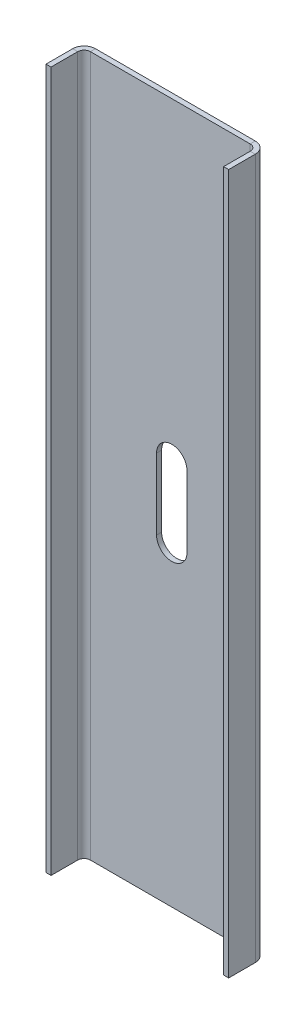
ISO-10303-21;
HEADER;
FILE_DESCRIPTION(('STEP AP214'),'2;1');
FILE_NAME('part.step','',(''),(''),'','','');
FILE_SCHEMA(('AUTOMOTIVE_DESIGN { 1 0 10303 214 1 1 1 1 }'));
ENDSEC;
DATA;
#1=APPLICATION_CONTEXT('core data for automotive mechanical design processes');
#2=APPLICATION_PROTOCOL_DEFINITION('international standard','automotive_design',2000,#1);
#3=PRODUCT_CONTEXT('',#1,'mechanical');
#4=PRODUCT('Part','Part','',(#3));
#5=PRODUCT_RELATED_PRODUCT_CATEGORY('part','',(#4));
#6=PRODUCT_DEFINITION_FORMATION('','',#4);
#7=PRODUCT_DEFINITION_CONTEXT('part definition',#1,'design');
#8=PRODUCT_DEFINITION('design','',#6,#7);
#9=PRODUCT_DEFINITION_SHAPE('','',#8);
#10=(LENGTH_UNIT() NAMED_UNIT(*) SI_UNIT(.MILLI.,.METRE.));
#11=(NAMED_UNIT(*) PLANE_ANGLE_UNIT() SI_UNIT($,.RADIAN.));
#12=(NAMED_UNIT(*) SI_UNIT($,.STERADIAN.) SOLID_ANGLE_UNIT());
#13=UNCERTAINTY_MEASURE_WITH_UNIT(LENGTH_MEASURE(1.E-05),#10,'distance_accuracy_value','');
#14=(GEOMETRIC_REPRESENTATION_CONTEXT(3) GLOBAL_UNCERTAINTY_ASSIGNED_CONTEXT((#13)) GLOBAL_UNIT_ASSIGNED_CONTEXT((#10,
#11,#12)) REPRESENTATION_CONTEXT('',''));
#15=CARTESIAN_POINT('',(0.,0.,0.));
#16=DIRECTION('',(0.,0.,1.));
#17=DIRECTION('',(1.,0.,0.));
#18=AXIS2_PLACEMENT_3D('',#15,#16,#17);
#19=CARTESIAN_POINT('',(0.,0.,-2.));
#20=DIRECTION('',(0.,0.,-1.));
#21=DIRECTION('',(-1.,0.,0.));
#22=AXIS2_PLACEMENT_3D('',#19,#20,#21);
#23=PLANE('',#22);
#24=DIRECTION('',(1.,0.,0.));
#25=VECTOR('',#24,1.);
#26=CARTESIAN_POINT('',(55.8,-102.375,-2.));
#27=LINE('',#26,#25);
#28=CARTESIAN_POINT('',(-11.7,-102.375,-2.00000000000003));
#29=VERTEX_POINT('',#28);
#30=CARTESIAN_POINT('',(51.3,-102.375,-2.));
#31=VERTEX_POINT('',#30);
#32=EDGE_CURVE('E327',#29,#31,#27,.T.);
#33=ORIENTED_EDGE('',*,*,#32,.F.);
#34=DIRECTION('',(0.,-1.,0.));
#35=VECTOR('',#34,1.);
#36=CARTESIAN_POINT('',(-11.7,-102.375,-2.00000000000003));
#37=LINE('',#36,#35);
#38=CARTESIAN_POINT('',(-11.7,173.625,-2.));
#39=VERTEX_POINT('',#38);
#40=EDGE_CURVE('E247',#29,#39,#37,.F.);
#41=ORIENTED_EDGE('',*,*,#40,.T.);
#42=DIRECTION('',(-1.,0.,0.));
#43=VECTOR('',#42,1.);
#44=CARTESIAN_POINT('',(55.8,173.625,-2.));
#45=LINE('',#44,#43);
#46=CARTESIAN_POINT('',(51.2999999999999,173.625,-2.00000000000001));
#47=VERTEX_POINT('',#46);
#48=EDGE_CURVE('E324',#47,#39,#45,.T.);
#49=ORIENTED_EDGE('',*,*,#48,.F.);
#50=DIRECTION('',(0.,1.,0.));
#51=VECTOR('',#50,1.);
#52=CARTESIAN_POINT('',(51.2999999999999,173.625,-2.00000000000001));
#53=LINE('',#52,#51);
#54=EDGE_CURVE('E300',#47,#31,#53,.F.);
#55=ORIENTED_EDGE('',*,*,#54,.T.);
#56=EDGE_LOOP('',(#33,#41,#49,#55));
#57=FACE_BOUND('',#56,.T.);
#58=DIRECTION('',(0.,1.,0.));
#59=VECTOR('',#58,1.);
#60=CARTESIAN_POINT('',(26.3825805897294,49.6250000000001,-2.00000000000003));
#61=LINE('',#60,#59);
#62=CARTESIAN_POINT('',(26.3825805897295,21.6250000000001,-2.00000000000003));
#63=VERTEX_POINT('',#62);
#64=CARTESIAN_POINT('',(26.3825805897294,49.6250000000001,-2.));
#65=VERTEX_POINT('',#64);
#66=EDGE_CURVE('E208',#63,#65,#61,.T.);
#67=ORIENTED_EDGE('',*,*,#66,.T.);
#68=CARTESIAN_POINT('',(20.3825805897294,49.6250000000001,-2.00000000000003));
#69=DIRECTION('',(0.,0.,1.));
#70=DIRECTION('',(1.,0.,0.));
#71=AXIS2_PLACEMENT_3D('',#68,#69,#70);
#72=CIRCLE('',#71,5.99999999999999);
#73=CARTESIAN_POINT('',(14.3825805897294,49.625,-2.00000000000003));
#74=VERTEX_POINT('',#73);
#75=EDGE_CURVE('E93',#65,#74,#72,.T.);
#76=ORIENTED_EDGE('',*,*,#75,.T.);
#77=DIRECTION('',(0.,-1.,0.));
#78=VECTOR('',#77,1.);
#79=CARTESIAN_POINT('',(14.3825805897294,49.625,-2.00000000000003));
#80=LINE('',#79,#78);
#81=CARTESIAN_POINT('',(14.3825805897295,21.6250000000001,-2.00000000000003));
#82=VERTEX_POINT('',#81);
#83=EDGE_CURVE('E199',#74,#82,#80,.T.);
#84=ORIENTED_EDGE('',*,*,#83,.T.);
#85=CARTESIAN_POINT('',(20.3825805897295,21.6250000000001,-2.00000000000003));
#86=DIRECTION('',(0.,0.,1.));
#87=DIRECTION('',(1.,0.,0.));
#88=AXIS2_PLACEMENT_3D('',#85,#86,#87);
#89=CIRCLE('',#88,6.);
#90=EDGE_CURVE('E205',#82,#63,#89,.T.);
#91=ORIENTED_EDGE('',*,*,#90,.T.);
#92=EDGE_LOOP('',(#67,#76,#84,#91));
#93=FACE_BOUND('',#92,.T.);
#94=ADVANCED_FACE('F78',(#57,#93),#23,.T.);
#95=CARTESIAN_POINT('',(0.,0.,0.));
#96=DIRECTION('',(0.,0.,-1.));
#97=DIRECTION('',(-1.,0.,0.));
#98=AXIS2_PLACEMENT_3D('',#95,#96,#97);
#99=PLANE('',#98);
#100=DIRECTION('',(0.,-1.,0.));
#101=VECTOR('',#100,1.);
#102=CARTESIAN_POINT('',(-11.7,-102.375,0.));
#103=LINE('',#102,#101);
#104=CARTESIAN_POINT('',(-11.7,-102.375,0.));
#105=VERTEX_POINT('',#104);
#106=CARTESIAN_POINT('',(-11.7,173.625,0.));
#107=VERTEX_POINT('',#106);
#108=EDGE_CURVE('E260',#105,#107,#103,.F.);
#109=ORIENTED_EDGE('',*,*,#108,.F.);
#110=DIRECTION('',(1.,0.,0.));
#111=VECTOR('',#110,1.);
#112=CARTESIAN_POINT('',(55.8,-102.375,0.));
#113=LINE('',#112,#111);
#114=CARTESIAN_POINT('',(51.3,-102.375,0.));
#115=VERTEX_POINT('',#114);
#116=EDGE_CURVE('E328',#105,#115,#113,.T.);
#117=ORIENTED_EDGE('',*,*,#116,.T.);
#118=DIRECTION('',(0.,1.,0.));
#119=VECTOR('',#118,1.);
#120=CARTESIAN_POINT('',(51.3,173.625,0.));
#121=LINE('',#120,#119);
#122=CARTESIAN_POINT('',(51.3,173.625,0.));
#123=VERTEX_POINT('',#122);
#124=EDGE_CURVE('E313',#123,#115,#121,.F.);
#125=ORIENTED_EDGE('',*,*,#124,.F.);
#126=DIRECTION('',(-1.,0.,0.));
#127=VECTOR('',#126,1.);
#128=CARTESIAN_POINT('',(55.8,173.625,0.));
#129=LINE('',#128,#127);
#130=EDGE_CURVE('E321',#123,#107,#129,.T.);
#131=ORIENTED_EDGE('',*,*,#130,.T.);
#132=EDGE_LOOP('',(#109,#117,#125,#131));
#133=FACE_BOUND('',#132,.T.);
#134=CARTESIAN_POINT('',(20.3825805897294,49.6250000000001,0.));
#135=DIRECTION('',(0.,0.,-1.));
#136=DIRECTION('',(-1.,0.,0.));
#137=AXIS2_PLACEMENT_3D('',#134,#135,#136);
#138=CIRCLE('',#137,5.99999999999999);
#139=CARTESIAN_POINT('',(26.3825805897294,49.6250000000001,0.));
#140=VERTEX_POINT('',#139);
#141=CARTESIAN_POINT('',(14.3825805897294,49.625,0.));
#142=VERTEX_POINT('',#141);
#143=EDGE_CURVE('E13',#140,#142,#138,.F.);
#144=ORIENTED_EDGE('',*,*,#143,.F.);
#145=DIRECTION('',(0.,1.,0.));
#146=VECTOR('',#145,1.);
#147=CARTESIAN_POINT('',(26.3825805897296,1.04609101499095E-13,0.));
#148=LINE('',#147,#146);
#149=CARTESIAN_POINT('',(26.3825805897295,21.6250000000001,0.));
#150=VERTEX_POINT('',#149);
#151=EDGE_CURVE('E330',#150,#140,#148,.T.);
#152=ORIENTED_EDGE('',*,*,#151,.F.);
#153=CARTESIAN_POINT('',(20.3825805897295,21.6250000000001,0.));
#154=DIRECTION('',(0.,0.,-1.));
#155=DIRECTION('',(-1.,0.,0.));
#156=AXIS2_PLACEMENT_3D('',#153,#154,#155);
#157=CIRCLE('',#156,6.);
#158=CARTESIAN_POINT('',(14.3825805897295,21.6250000000001,0.));
#159=VERTEX_POINT('',#158);
#160=EDGE_CURVE('E335',#159,#150,#157,.F.);
#161=ORIENTED_EDGE('',*,*,#160,.F.);
#162=DIRECTION('',(0.,-1.,0.));
#163=VECTOR('',#162,1.);
#164=CARTESIAN_POINT('',(14.3825805897296,0.,0.));
#165=LINE('',#164,#163);
#166=EDGE_CURVE('E86',#142,#159,#165,.T.);
#167=ORIENTED_EDGE('',*,*,#166,.F.);
#168=EDGE_LOOP('',(#144,#152,#161,#167));
#169=FACE_BOUND('',#168,.T.);
#170=ADVANCED_FACE('F341',(#133,#169),#99,.F.);
#171=CARTESIAN_POINT('',(55.8,-102.375,-2.));
#172=DIRECTION('',(0.,-1.,0.));
#173=DIRECTION('',(0.,0.,-1.));
#174=AXIS2_PLACEMENT_3D('',#171,#172,#173);
#175=PLANE('',#174);
#176=ORIENTED_EDGE('',*,*,#116,.F.);
#177=DIRECTION('',(0.,0.,-1.));
#178=VECTOR('',#177,1.);
#179=CARTESIAN_POINT('',(-11.7,-102.375,0.));
#180=LINE('',#179,#178);
#181=EDGE_CURVE('E254',#105,#29,#180,.T.);
#182=ORIENTED_EDGE('',*,*,#181,.T.);
#183=ORIENTED_EDGE('',*,*,#32,.T.);
#184=DIRECTION('',(0.,0.,-1.));
#185=VECTOR('',#184,1.);
#186=CARTESIAN_POINT('',(51.3,-102.375,0.));
#187=LINE('',#186,#185);
#188=EDGE_CURVE('E318',#115,#31,#187,.T.);
#189=ORIENTED_EDGE('',*,*,#188,.F.);
#190=EDGE_LOOP('',(#176,#182,#183,#189));
#191=FACE_BOUND('',#190,.T.);
#192=ADVANCED_FACE('F355',(#191),#175,.T.);
#193=CARTESIAN_POINT('',(55.8,173.625,-2.));
#194=DIRECTION('',(0.,1.,0.));
#195=DIRECTION('',(-1.,0.,0.));
#196=AXIS2_PLACEMENT_3D('',#193,#194,#195);
#197=PLANE('',#196);
#198=DIRECTION('',(0.,0.,-1.));
#199=VECTOR('',#198,1.);
#200=CARTESIAN_POINT('',(-11.7,173.625,0.));
#201=LINE('',#200,#199);
#202=EDGE_CURVE('E264',#107,#39,#201,.T.);
#203=ORIENTED_EDGE('',*,*,#202,.F.);
#204=ORIENTED_EDGE('',*,*,#130,.F.);
#205=DIRECTION('',(0.,0.,-1.));
#206=VECTOR('',#205,1.);
#207=CARTESIAN_POINT('',(51.3,173.625,0.));
#208=LINE('',#207,#206);
#209=EDGE_CURVE('E307',#123,#47,#208,.T.);
#210=ORIENTED_EDGE('',*,*,#209,.T.);
#211=ORIENTED_EDGE('',*,*,#48,.T.);
#212=EDGE_LOOP('',(#203,#204,#210,#211));
#213=FACE_BOUND('',#212,.T.);
#214=ADVANCED_FACE('F80',(#213),#197,.T.);
#215=CARTESIAN_POINT('',(51.3,-102.375,2.49999999999999));
#216=DIRECTION('',(0.,-1.,0.));
#217=DIRECTION('',(0.,0.,-1.));
#218=AXIS2_PLACEMENT_3D('',#215,#216,#217);
#219=PLANE('',#218);
#220=DIRECTION('',(-1.,0.,0.));
#221=VECTOR('',#220,1.);
#222=CARTESIAN_POINT('',(55.8,-102.375,2.49999999999998));
#223=LINE('',#222,#221);
#224=CARTESIAN_POINT('',(53.8,-102.375,2.49999999999998));
#225=VERTEX_POINT('',#224);
#226=CARTESIAN_POINT('',(55.8,-102.375,2.49999999999997));
#227=VERTEX_POINT('',#226);
#228=EDGE_CURVE('E267',#225,#227,#223,.F.);
#229=ORIENTED_EDGE('',*,*,#228,.F.);
#230=CARTESIAN_POINT('',(51.3,-102.375,2.49999999999999));
#231=DIRECTION('',(0.,1.,0.));
#232=DIRECTION('',(0.,0.,1.));
#233=AXIS2_PLACEMENT_3D('',#230,#231,#232);
#234=CIRCLE('',#233,2.50000000000002);
#235=EDGE_CURVE('E310',#115,#225,#234,.F.);
#236=ORIENTED_EDGE('',*,*,#235,.F.);
#237=ORIENTED_EDGE('',*,*,#188,.T.);
#238=CARTESIAN_POINT('',(51.3,-102.375,2.49999999999999));
#239=DIRECTION('',(0.,1.,0.));
#240=DIRECTION('',(0.,0.,1.));
#241=AXIS2_PLACEMENT_3D('',#238,#239,#240);
#242=CIRCLE('',#241,4.50000000000002);
#243=EDGE_CURVE('E303',#31,#227,#242,.F.);
#244=ORIENTED_EDGE('',*,*,#243,.T.);
#245=EDGE_LOOP('',(#229,#236,#237,#244));
#246=FACE_BOUND('',#245,.T.);
#247=ADVANCED_FACE('F367',(#246),#219,.T.);
#248=CARTESIAN_POINT('',(51.3,173.625,2.50000000000001));
#249=DIRECTION('',(0.,-1.,0.));
#250=DIRECTION('',(0.,0.,-1.));
#251=AXIS2_PLACEMENT_3D('',#248,#249,#250);
#252=PLANE('',#251);
#253=CARTESIAN_POINT('',(51.3,173.625,2.50000000000001));
#254=DIRECTION('',(0.,1.,0.));
#255=DIRECTION('',(0.,0.,1.));
#256=AXIS2_PLACEMENT_3D('',#253,#254,#255);
#257=CIRCLE('',#256,2.50000000000002);
#258=CARTESIAN_POINT('',(53.8,173.625,2.5));
#259=VERTEX_POINT('',#258);
#260=EDGE_CURVE('E273',#259,#123,#257,.T.);
#261=ORIENTED_EDGE('',*,*,#260,.F.);
#262=DIRECTION('',(-1.,0.,0.));
#263=VECTOR('',#262,1.);
#264=CARTESIAN_POINT('',(53.8,173.625,2.5));
#265=LINE('',#264,#263);
#266=CARTESIAN_POINT('',(55.8,173.625,2.49999999999999));
#267=VERTEX_POINT('',#266);
#268=EDGE_CURVE('E293',#259,#267,#265,.F.);
#269=ORIENTED_EDGE('',*,*,#268,.T.);
#270=CARTESIAN_POINT('',(51.3,173.625,2.50000000000001));
#271=DIRECTION('',(0.,1.,0.));
#272=DIRECTION('',(0.,0.,1.));
#273=AXIS2_PLACEMENT_3D('',#270,#271,#272);
#274=CIRCLE('',#273,4.50000000000002);
#275=EDGE_CURVE('E304',#267,#47,#274,.T.);
#276=ORIENTED_EDGE('',*,*,#275,.T.);
#277=ORIENTED_EDGE('',*,*,#209,.F.);
#278=EDGE_LOOP('',(#261,#269,#276,#277));
#279=FACE_BOUND('',#278,.T.);
#280=ADVANCED_FACE('F360',(#279),#252,.F.);
#281=CARTESIAN_POINT('',(51.3,173.625,2.50000000000001));
#282=DIRECTION('',(0.,1.,0.));
#283=DIRECTION('',(1.,0.,0.));
#284=AXIS2_PLACEMENT_3D('',#281,#282,#283);
#285=CYLINDRICAL_SURFACE('',#284,4.50000000000002);
#286=ORIENTED_EDGE('',*,*,#54,.F.);
#287=ORIENTED_EDGE('',*,*,#275,.F.);
#288=DIRECTION('',(0.,1.,0.));
#289=VECTOR('',#288,1.);
#290=CARTESIAN_POINT('',(55.8,-102.375,2.49999999999998));
#291=LINE('',#290,#289);
#292=EDGE_CURVE('E291',#267,#227,#291,.F.);
#293=ORIENTED_EDGE('',*,*,#292,.T.);
#294=ORIENTED_EDGE('',*,*,#243,.F.);
#295=EDGE_LOOP('',(#286,#287,#293,#294));
#296=FACE_BOUND('',#295,.T.);
#297=ADVANCED_FACE('F409',(#296),#285,.T.);
#298=CARTESIAN_POINT('',(51.3,173.625,2.50000000000001));
#299=DIRECTION('',(0.,1.,0.));
#300=DIRECTION('',(1.,0.,0.));
#301=AXIS2_PLACEMENT_3D('',#298,#299,#300);
#302=CYLINDRICAL_SURFACE('',#301,2.50000000000002);
#303=ORIENTED_EDGE('',*,*,#124,.T.);
#304=ORIENTED_EDGE('',*,*,#235,.T.);
#305=DIRECTION('',(0.,1.,0.));
#306=VECTOR('',#305,1.);
#307=CARTESIAN_POINT('',(53.8,-102.375,2.49999999999999));
#308=LINE('',#307,#306);
#309=EDGE_CURVE('E296',#225,#259,#308,.T.);
#310=ORIENTED_EDGE('',*,*,#309,.T.);
#311=ORIENTED_EDGE('',*,*,#260,.T.);
#312=EDGE_LOOP('',(#303,#304,#310,#311));
#313=FACE_BOUND('',#312,.T.);
#314=ADVANCED_FACE('F376',(#313),#302,.F.);
#315=CARTESIAN_POINT('',(55.8,173.625,13.));
#316=DIRECTION('',(0.,-1.,0.));
#317=DIRECTION('',(1.,0.,0.));
#318=AXIS2_PLACEMENT_3D('',#315,#316,#317);
#319=PLANE('',#318);
#320=ORIENTED_EDGE('',*,*,#268,.F.);
#321=DIRECTION('',(0.,0.,-1.));
#322=VECTOR('',#321,1.);
#323=CARTESIAN_POINT('',(53.8,173.625,13.));
#324=LINE('',#323,#322);
#325=CARTESIAN_POINT('',(53.8,173.625,13.));
#326=VERTEX_POINT('',#325);
#327=EDGE_CURVE('E289',#259,#326,#324,.F.);
#328=ORIENTED_EDGE('',*,*,#327,.T.);
#329=DIRECTION('',(-1.,0.,0.));
#330=VECTOR('',#329,1.);
#331=CARTESIAN_POINT('',(55.8,173.625,13.));
#332=LINE('',#331,#330);
#333=CARTESIAN_POINT('',(55.8,173.625,13.));
#334=VERTEX_POINT('',#333);
#335=EDGE_CURVE('E270',#334,#326,#332,.T.);
#336=ORIENTED_EDGE('',*,*,#335,.F.);
#337=DIRECTION('',(0.,0.,1.));
#338=VECTOR('',#337,1.);
#339=CARTESIAN_POINT('',(55.8,173.625,-2.15470036436622E-13));
#340=LINE('',#339,#338);
#341=EDGE_CURVE('E282',#267,#334,#340,.T.);
#342=ORIENTED_EDGE('',*,*,#341,.F.);
#343=EDGE_LOOP('',(#320,#328,#336,#342));
#344=FACE_BOUND('',#343,.T.);
#345=ADVANCED_FACE('F401',(#344),#319,.F.);
#346=CARTESIAN_POINT('',(55.8,-102.375,0.));
#347=DIRECTION('',(0.,1.,0.));
#348=DIRECTION('',(-1.,0.,0.));
#349=AXIS2_PLACEMENT_3D('',#346,#347,#348);
#350=PLANE('',#349);
#351=ORIENTED_EDGE('',*,*,#228,.T.);
#352=DIRECTION('',(0.,0.,-1.));
#353=VECTOR('',#352,1.);
#354=CARTESIAN_POINT('',(55.8,-102.375,-2.15470036436622E-13));
#355=LINE('',#354,#353);
#356=CARTESIAN_POINT('',(55.8,-102.375,13.));
#357=VERTEX_POINT('',#356);
#358=EDGE_CURVE('E277',#357,#227,#355,.T.);
#359=ORIENTED_EDGE('',*,*,#358,.F.);
#360=DIRECTION('',(-1.,0.,0.));
#361=VECTOR('',#360,1.);
#362=CARTESIAN_POINT('',(55.8,-102.375,13.));
#363=LINE('',#362,#361);
#364=CARTESIAN_POINT('',(53.8,-102.375,13.));
#365=VERTEX_POINT('',#364);
#366=EDGE_CURVE('E274',#357,#365,#363,.T.);
#367=ORIENTED_EDGE('',*,*,#366,.T.);
#368=DIRECTION('',(0.,0.,1.));
#369=VECTOR('',#368,1.);
#370=CARTESIAN_POINT('',(53.8,-102.375,0.));
#371=LINE('',#370,#369);
#372=EDGE_CURVE('E284',#365,#225,#371,.F.);
#373=ORIENTED_EDGE('',*,*,#372,.T.);
#374=EDGE_LOOP('',(#351,#359,#367,#373));
#375=FACE_BOUND('',#374,.T.);
#376=ADVANCED_FACE('F383',(#375),#350,.F.);
#377=CARTESIAN_POINT('',(55.8,0.,-2.15470036436622E-13));
#378=DIRECTION('',(-1.,0.,0.));
#379=DIRECTION('',(0.,0.,1.));
#380=AXIS2_PLACEMENT_3D('',#377,#378,#379);
#381=PLANE('',#380);
#382=ORIENTED_EDGE('',*,*,#292,.F.);
#383=ORIENTED_EDGE('',*,*,#341,.T.);
#384=DIRECTION('',(0.,-1.,0.));
#385=VECTOR('',#384,1.);
#386=CARTESIAN_POINT('',(55.8,0.,13.));
#387=LINE('',#386,#385);
#388=EDGE_CURVE('E280',#334,#357,#387,.T.);
#389=ORIENTED_EDGE('',*,*,#388,.T.);
#390=ORIENTED_EDGE('',*,*,#358,.T.);
#391=EDGE_LOOP('',(#382,#383,#389,#390));
#392=FACE_BOUND('',#391,.T.);
#393=ADVANCED_FACE('F387',(#392),#381,.F.);
#394=CARTESIAN_POINT('',(53.8,0.,-2.08487073758936E-13));
#395=DIRECTION('',(-1.,0.,0.));
#396=DIRECTION('',(0.,0.,1.));
#397=AXIS2_PLACEMENT_3D('',#394,#395,#396);
#398=PLANE('',#397);
#399=ORIENTED_EDGE('',*,*,#327,.F.);
#400=ORIENTED_EDGE('',*,*,#309,.F.);
#401=ORIENTED_EDGE('',*,*,#372,.F.);
#402=DIRECTION('',(0.,1.,0.));
#403=VECTOR('',#402,1.);
#404=CARTESIAN_POINT('',(53.8,-102.375,13.));
#405=LINE('',#404,#403);
#406=EDGE_CURVE('E287',#326,#365,#405,.F.);
#407=ORIENTED_EDGE('',*,*,#406,.F.);
#408=EDGE_LOOP('',(#399,#400,#401,#407));
#409=FACE_BOUND('',#408,.T.);
#410=ADVANCED_FACE('F397',(#409),#398,.T.);
#411=CARTESIAN_POINT('',(55.8,-102.375,13.));
#412=DIRECTION('',(0.,0.,-1.));
#413=DIRECTION('',(-1.,0.,0.));
#414=AXIS2_PLACEMENT_3D('',#411,#412,#413);
#415=PLANE('',#414);
#416=ORIENTED_EDGE('',*,*,#406,.T.);
#417=ORIENTED_EDGE('',*,*,#366,.F.);
#418=ORIENTED_EDGE('',*,*,#388,.F.);
#419=ORIENTED_EDGE('',*,*,#335,.T.);
#420=EDGE_LOOP('',(#416,#417,#418,#419));
#421=FACE_BOUND('',#420,.T.);
#422=ADVANCED_FACE('F393',(#421),#415,.F.);
#423=CARTESIAN_POINT('',(-11.7,173.625,2.5));
#424=DIRECTION('',(0.,1.,0.));
#425=DIRECTION('',(0.,0.,1.));
#426=AXIS2_PLACEMENT_3D('',#423,#424,#425);
#427=PLANE('',#426);
#428=DIRECTION('',(1.,0.,0.));
#429=VECTOR('',#428,1.);
#430=CARTESIAN_POINT('',(-16.2000000000001,173.625,2.49999999999998));
#431=LINE('',#430,#429);
#432=CARTESIAN_POINT('',(-14.2,173.625,2.49999999999999));
#433=VERTEX_POINT('',#432);
#434=CARTESIAN_POINT('',(-16.2,173.625,2.49999999999998));
#435=VERTEX_POINT('',#434);
#436=EDGE_CURVE('E195',#433,#435,#431,.F.);
#437=ORIENTED_EDGE('',*,*,#436,.F.);
#438=CARTESIAN_POINT('',(-11.7,173.625,2.5));
#439=DIRECTION('',(0.,-1.,0.));
#440=DIRECTION('',(0.,0.,-1.));
#441=AXIS2_PLACEMENT_3D('',#438,#439,#440);
#442=CIRCLE('',#441,2.50000000000002);
#443=EDGE_CURVE('E257',#107,#433,#442,.F.);
#444=ORIENTED_EDGE('',*,*,#443,.F.);
#445=ORIENTED_EDGE('',*,*,#202,.T.);
#446=CARTESIAN_POINT('',(-11.7,173.625,2.5));
#447=DIRECTION('',(0.,-1.,0.));
#448=DIRECTION('',(0.,0.,-1.));
#449=AXIS2_PLACEMENT_3D('',#446,#447,#448);
#450=CIRCLE('',#449,4.50000000000002);
#451=EDGE_CURVE('E250',#39,#435,#450,.F.);
#452=ORIENTED_EDGE('',*,*,#451,.T.);
#453=EDGE_LOOP('',(#437,#444,#445,#452));
#454=FACE_BOUND('',#453,.T.);
#455=ADVANCED_FACE('F468',(#454),#427,.T.);
#456=CARTESIAN_POINT('',(-11.7,-102.375,2.5));
#457=DIRECTION('',(0.,1.,0.));
#458=DIRECTION('',(0.,0.,1.));
#459=AXIS2_PLACEMENT_3D('',#456,#457,#458);
#460=PLANE('',#459);
#461=CARTESIAN_POINT('',(-11.7,-102.375,2.5));
#462=DIRECTION('',(0.,-1.,0.));
#463=DIRECTION('',(0.,0.,-1.));
#464=AXIS2_PLACEMENT_3D('',#461,#462,#463);
#465=CIRCLE('',#464,2.50000000000002);
#466=CARTESIAN_POINT('',(-14.2,-102.375,2.49999999999999));
#467=VERTEX_POINT('',#466);
#468=EDGE_CURVE('E220',#467,#105,#465,.T.);
#469=ORIENTED_EDGE('',*,*,#468,.F.);
#470=DIRECTION('',(1.,0.,0.));
#471=VECTOR('',#470,1.);
#472=CARTESIAN_POINT('',(-14.2,-102.375,2.49999999999998));
#473=LINE('',#472,#471);
#474=CARTESIAN_POINT('',(-16.2,-102.375,2.49999999999997));
#475=VERTEX_POINT('',#474);
#476=EDGE_CURVE('E240',#467,#475,#473,.F.);
#477=ORIENTED_EDGE('',*,*,#476,.T.);
#478=CARTESIAN_POINT('',(-11.7,-102.375,2.5));
#479=DIRECTION('',(0.,-1.,0.));
#480=DIRECTION('',(0.,0.,-1.));
#481=AXIS2_PLACEMENT_3D('',#478,#479,#480);
#482=CIRCLE('',#481,4.50000000000002);
#483=EDGE_CURVE('E251',#475,#29,#482,.T.);
#484=ORIENTED_EDGE('',*,*,#483,.T.);
#485=ORIENTED_EDGE('',*,*,#181,.F.);
#486=EDGE_LOOP('',(#469,#477,#484,#485));
#487=FACE_BOUND('',#486,.T.);
#488=ADVANCED_FACE('F490',(#487),#460,.F.);
#489=CARTESIAN_POINT('',(-11.7,-102.375,2.5));
#490=DIRECTION('',(0.,-1.,0.));
#491=DIRECTION('',(-1.,0.,0.));
#492=AXIS2_PLACEMENT_3D('',#489,#490,#491);
#493=CYLINDRICAL_SURFACE('',#492,4.50000000000002);
#494=ORIENTED_EDGE('',*,*,#40,.F.);
#495=ORIENTED_EDGE('',*,*,#483,.F.);
#496=DIRECTION('',(0.,-1.,0.));
#497=VECTOR('',#496,1.);
#498=CARTESIAN_POINT('',(-16.2000000000001,173.625,2.49999999999998));
#499=LINE('',#498,#497);
#500=EDGE_CURVE('E238',#475,#435,#499,.F.);
#501=ORIENTED_EDGE('',*,*,#500,.T.);
#502=ORIENTED_EDGE('',*,*,#451,.F.);
#503=EDGE_LOOP('',(#494,#495,#501,#502));
#504=FACE_BOUND('',#503,.T.);
#505=ADVANCED_FACE('F500',(#504),#493,.T.);
#506=CARTESIAN_POINT('',(-11.7,-102.375,2.5));
#507=DIRECTION('',(0.,-1.,0.));
#508=DIRECTION('',(-1.,0.,0.));
#509=AXIS2_PLACEMENT_3D('',#506,#507,#508);
#510=CYLINDRICAL_SURFACE('',#509,2.50000000000002);
#511=ORIENTED_EDGE('',*,*,#108,.T.);
#512=ORIENTED_EDGE('',*,*,#443,.T.);
#513=DIRECTION('',(0.,-1.,0.));
#514=VECTOR('',#513,1.);
#515=CARTESIAN_POINT('',(-14.2,173.625,2.49999999999999));
#516=LINE('',#515,#514);
#517=EDGE_CURVE('E243',#433,#467,#516,.T.);
#518=ORIENTED_EDGE('',*,*,#517,.T.);
#519=ORIENTED_EDGE('',*,*,#468,.T.);
#520=EDGE_LOOP('',(#511,#512,#518,#519));
#521=FACE_BOUND('',#520,.T.);
#522=ADVANCED_FACE('F511',(#521),#510,.F.);
#523=CARTESIAN_POINT('',(-16.2,-102.375,13.));
#524=DIRECTION('',(0.,1.,0.));
#525=DIRECTION('',(-1.,0.,0.));
#526=AXIS2_PLACEMENT_3D('',#523,#524,#525);
#527=PLANE('',#526);
#528=ORIENTED_EDGE('',*,*,#476,.F.);
#529=DIRECTION('',(0.,0.,-1.));
#530=VECTOR('',#529,1.);
#531=CARTESIAN_POINT('',(-14.2,-102.375,13.));
#532=LINE('',#531,#530);
#533=CARTESIAN_POINT('',(-14.2,-102.375,13.));
#534=VERTEX_POINT('',#533);
#535=EDGE_CURVE('E236',#467,#534,#532,.F.);
#536=ORIENTED_EDGE('',*,*,#535,.T.);
#537=DIRECTION('',(1.,0.,0.));
#538=VECTOR('',#537,1.);
#539=CARTESIAN_POINT('',(-16.2,-102.375,13.));
#540=LINE('',#539,#538);
#541=CARTESIAN_POINT('',(-16.2,-102.375,13.));
#542=VERTEX_POINT('',#541);
#543=EDGE_CURVE('E217',#542,#534,#540,.T.);
#544=ORIENTED_EDGE('',*,*,#543,.F.);
#545=DIRECTION('',(0.,0.,1.));
#546=VECTOR('',#545,1.);
#547=CARTESIAN_POINT('',(-16.2,-102.375,0.));
#548=LINE('',#547,#546);
#549=EDGE_CURVE('E229',#475,#542,#548,.T.);
#550=ORIENTED_EDGE('',*,*,#549,.F.);
#551=EDGE_LOOP('',(#528,#536,#544,#550));
#552=FACE_BOUND('',#551,.T.);
#553=ADVANCED_FACE('F522',(#552),#527,.F.);
#554=CARTESIAN_POINT('',(-16.2,173.625,0.));
#555=DIRECTION('',(0.,-1.,0.));
#556=DIRECTION('',(1.,0.,0.));
#557=AXIS2_PLACEMENT_3D('',#554,#555,#556);
#558=PLANE('',#557);
#559=ORIENTED_EDGE('',*,*,#436,.T.);
#560=DIRECTION('',(0.,0.,-1.));
#561=VECTOR('',#560,1.);
#562=CARTESIAN_POINT('',(-16.2,173.625,0.));
#563=LINE('',#562,#561);
#564=CARTESIAN_POINT('',(-16.2000000000001,173.625,13.));
#565=VERTEX_POINT('',#564);
#566=EDGE_CURVE('E224',#565,#435,#563,.T.);
#567=ORIENTED_EDGE('',*,*,#566,.F.);
#568=DIRECTION('',(1.,0.,0.));
#569=VECTOR('',#568,1.);
#570=CARTESIAN_POINT('',(-16.2000000000001,173.625,13.));
#571=LINE('',#570,#569);
#572=CARTESIAN_POINT('',(-14.2000000000001,173.625,13.));
#573=VERTEX_POINT('',#572);
#574=EDGE_CURVE('E221',#565,#573,#571,.T.);
#575=ORIENTED_EDGE('',*,*,#574,.T.);
#576=DIRECTION('',(0.,0.,1.));
#577=VECTOR('',#576,1.);
#578=CARTESIAN_POINT('',(-14.2,173.625,0.));
#579=LINE('',#578,#577);
#580=EDGE_CURVE('E231',#573,#433,#579,.F.);
#581=ORIENTED_EDGE('',*,*,#580,.T.);
#582=EDGE_LOOP('',(#559,#567,#575,#581));
#583=FACE_BOUND('',#582,.T.);
#584=ADVANCED_FACE('F533',(#583),#558,.F.);
#585=CARTESIAN_POINT('',(-16.2,0.,0.));
#586=DIRECTION('',(1.,0.,0.));
#587=DIRECTION('',(0.,0.,-1.));
#588=AXIS2_PLACEMENT_3D('',#585,#586,#587);
#589=PLANE('',#588);
#590=ORIENTED_EDGE('',*,*,#500,.F.);
#591=ORIENTED_EDGE('',*,*,#549,.T.);
#592=DIRECTION('',(0.,1.,0.));
#593=VECTOR('',#592,1.);
#594=CARTESIAN_POINT('',(-16.2000000000001,0.,13.));
#595=LINE('',#594,#593);
#596=EDGE_CURVE('E227',#542,#565,#595,.T.);
#597=ORIENTED_EDGE('',*,*,#596,.T.);
#598=ORIENTED_EDGE('',*,*,#566,.T.);
#599=EDGE_LOOP('',(#590,#591,#597,#598));
#600=FACE_BOUND('',#599,.T.);
#601=ADVANCED_FACE('F544',(#600),#589,.F.);
#602=CARTESIAN_POINT('',(-14.2,0.,0.));
#603=DIRECTION('',(1.,0.,0.));
#604=DIRECTION('',(0.,0.,-1.));
#605=AXIS2_PLACEMENT_3D('',#602,#603,#604);
#606=PLANE('',#605);
#607=ORIENTED_EDGE('',*,*,#535,.F.);
#608=ORIENTED_EDGE('',*,*,#517,.F.);
#609=ORIENTED_EDGE('',*,*,#580,.F.);
#610=DIRECTION('',(0.,-1.,0.));
#611=VECTOR('',#610,1.);
#612=CARTESIAN_POINT('',(-14.2000000000001,173.625,13.));
#613=LINE('',#612,#611);
#614=EDGE_CURVE('E234',#534,#573,#613,.F.);
#615=ORIENTED_EDGE('',*,*,#614,.F.);
#616=EDGE_LOOP('',(#607,#608,#609,#615));
#617=FACE_BOUND('',#616,.T.);
#618=ADVANCED_FACE('F555',(#617),#606,.T.);
#619=CARTESIAN_POINT('',(-16.2000000000001,173.625,13.));
#620=DIRECTION('',(0.,0.,-1.));
#621=DIRECTION('',(-1.,0.,0.));
#622=AXIS2_PLACEMENT_3D('',#619,#620,#621);
#623=PLANE('',#622);
#624=ORIENTED_EDGE('',*,*,#614,.T.);
#625=ORIENTED_EDGE('',*,*,#574,.F.);
#626=ORIENTED_EDGE('',*,*,#596,.F.);
#627=ORIENTED_EDGE('',*,*,#543,.T.);
#628=EDGE_LOOP('',(#624,#625,#626,#627));
#629=FACE_BOUND('',#628,.T.);
#630=ADVANCED_FACE('F566',(#629),#623,.F.);
#631=CARTESIAN_POINT('',(20.3825805897294,49.6250000000001,13.));
#632=DIRECTION('',(0.,0.,-1.));
#633=DIRECTION('',(-1.,0.,0.));
#634=AXIS2_PLACEMENT_3D('',#631,#632,#633);
#635=CYLINDRICAL_SURFACE('',#634,5.99999999999999);
#636=ORIENTED_EDGE('',*,*,#143,.T.);
#637=DIRECTION('',(0.,0.,-1.));
#638=VECTOR('',#637,1.);
#639=CARTESIAN_POINT('',(14.3825805897294,49.625,13.));
#640=LINE('',#639,#638);
#641=EDGE_CURVE('E189',#142,#74,#640,.T.);
#642=ORIENTED_EDGE('',*,*,#641,.T.);
#643=ORIENTED_EDGE('',*,*,#75,.F.);
#644=DIRECTION('',(0.,0.,-1.));
#645=VECTOR('',#644,1.);
#646=CARTESIAN_POINT('',(26.3825805897294,49.6250000000001,13.));
#647=LINE('',#646,#645);
#648=EDGE_CURVE('E213',#140,#65,#647,.T.);
#649=ORIENTED_EDGE('',*,*,#648,.F.);
#650=EDGE_LOOP('',(#636,#642,#643,#649));
#651=FACE_BOUND('',#650,.T.);
#652=ADVANCED_FACE('F191',(#651),#635,.F.);
#653=CARTESIAN_POINT('',(14.3825805897294,49.625,13.));
#654=DIRECTION('',(1.,0.,0.));
#655=DIRECTION('',(0.,1.,0.));
#656=AXIS2_PLACEMENT_3D('',#653,#654,#655);
#657=PLANE('',#656);
#658=ORIENTED_EDGE('',*,*,#166,.T.);
#659=DIRECTION('',(0.,0.,-1.));
#660=VECTOR('',#659,1.);
#661=CARTESIAN_POINT('',(14.3825805897295,21.6250000000001,13.));
#662=LINE('',#661,#660);
#663=EDGE_CURVE('E196',#159,#82,#662,.T.);
#664=ORIENTED_EDGE('',*,*,#663,.T.);
#665=ORIENTED_EDGE('',*,*,#83,.F.);
#666=ORIENTED_EDGE('',*,*,#641,.F.);
#667=EDGE_LOOP('',(#658,#664,#665,#666));
#668=FACE_BOUND('',#667,.T.);
#669=ADVANCED_FACE('F200',(#668),#657,.T.);
#670=CARTESIAN_POINT('',(20.3825805897295,21.6250000000001,13.));
#671=DIRECTION('',(0.,0.,-1.));
#672=DIRECTION('',(-1.,0.,0.));
#673=AXIS2_PLACEMENT_3D('',#670,#671,#672);
#674=CYLINDRICAL_SURFACE('',#673,6.);
#675=ORIENTED_EDGE('',*,*,#160,.T.);
#676=DIRECTION('',(0.,0.,-1.));
#677=VECTOR('',#676,1.);
#678=CARTESIAN_POINT('',(26.3825805897295,21.6250000000001,13.));
#679=LINE('',#678,#677);
#680=EDGE_CURVE('E101',#150,#63,#679,.T.);
#681=ORIENTED_EDGE('',*,*,#680,.T.);
#682=ORIENTED_EDGE('',*,*,#90,.F.);
#683=ORIENTED_EDGE('',*,*,#663,.F.);
#684=EDGE_LOOP('',(#675,#681,#682,#683));
#685=FACE_BOUND('',#684,.T.);
#686=ADVANCED_FACE('F339',(#685),#674,.F.);
#687=CARTESIAN_POINT('',(26.3825805897294,49.6250000000001,13.));
#688=DIRECTION('',(-1.,0.,0.));
#689=DIRECTION('',(0.,-1.,0.));
#690=AXIS2_PLACEMENT_3D('',#687,#688,#689);
#691=PLANE('',#690);
#692=ORIENTED_EDGE('',*,*,#151,.T.);
#693=ORIENTED_EDGE('',*,*,#648,.T.);
#694=ORIENTED_EDGE('',*,*,#66,.F.);
#695=ORIENTED_EDGE('',*,*,#680,.F.);
#696=EDGE_LOOP('',(#692,#693,#694,#695));
#697=FACE_BOUND('',#696,.T.);
#698=ADVANCED_FACE('F342',(#697),#691,.T.);
#699=CLOSED_SHELL('',(#94,#170,#192,#214,#247,#280,#297,#314,#345,#376,#393,#410,#422,#455,#488,
#505,#522,#553,#584,#601,#618,#630,#652,#669,#686,#698));
#700=MANIFOLD_SOLID_BREP('B2',#699);
#701=ADVANCED_BREP_SHAPE_REPRESENTATION('',(#18,#700),#14);
#702=SHAPE_DEFINITION_REPRESENTATION(#9,#701);
ENDSEC;
END-ISO-10303-21;
